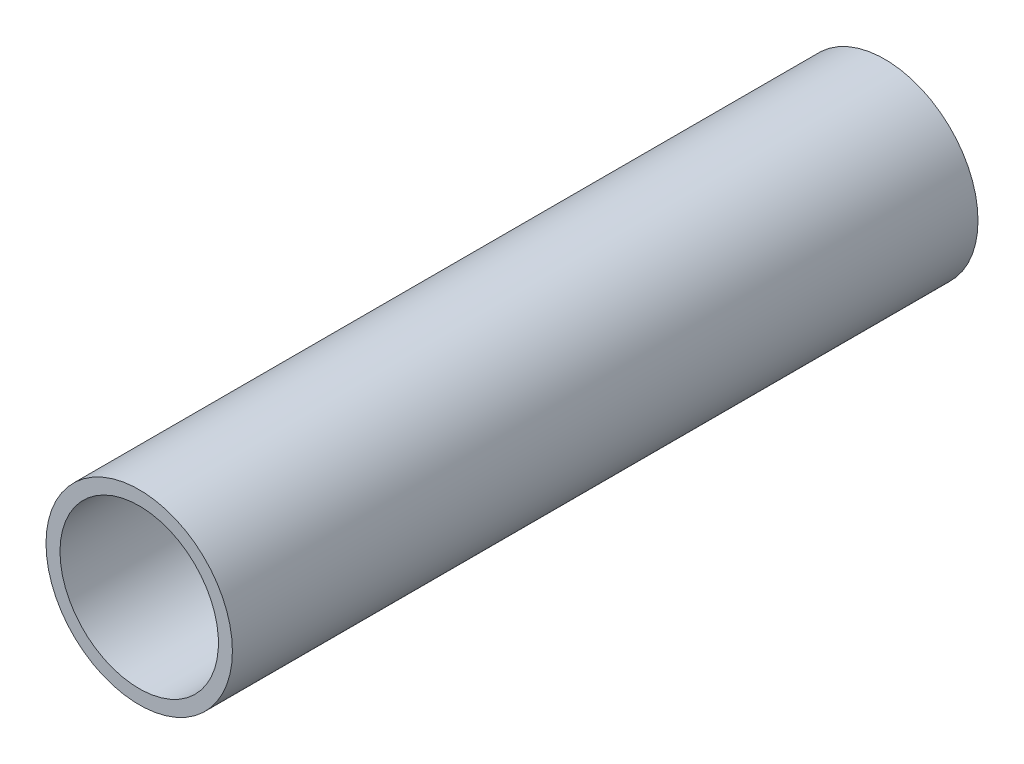
ISO-10303-21;
HEADER;
FILE_DESCRIPTION(('STEP AP214'),'2;1');
FILE_NAME('part.step','',(''),(''),'','','');
FILE_SCHEMA(('AUTOMOTIVE_DESIGN { 1 0 10303 214 1 1 1 1 }'));
ENDSEC;
DATA;
#1=APPLICATION_CONTEXT('core data for automotive mechanical design processes');
#2=APPLICATION_PROTOCOL_DEFINITION('international standard','automotive_design',2000,#1);
#3=PRODUCT_CONTEXT('',#1,'mechanical');
#4=PRODUCT('Part','Part','',(#3));
#5=PRODUCT_RELATED_PRODUCT_CATEGORY('part','',(#4));
#6=PRODUCT_DEFINITION_FORMATION('','',#4);
#7=PRODUCT_DEFINITION_CONTEXT('part definition',#1,'design');
#8=PRODUCT_DEFINITION('design','',#6,#7);
#9=PRODUCT_DEFINITION_SHAPE('','',#8);
#10=(LENGTH_UNIT() NAMED_UNIT(*) SI_UNIT(.MILLI.,.METRE.));
#11=(NAMED_UNIT(*) PLANE_ANGLE_UNIT() SI_UNIT($,.RADIAN.));
#12=(NAMED_UNIT(*) SI_UNIT($,.STERADIAN.) SOLID_ANGLE_UNIT());
#13=UNCERTAINTY_MEASURE_WITH_UNIT(LENGTH_MEASURE(1.E-05),#10,'distance_accuracy_value','');
#14=(GEOMETRIC_REPRESENTATION_CONTEXT(3) GLOBAL_UNCERTAINTY_ASSIGNED_CONTEXT((#13)) GLOBAL_UNIT_ASSIGNED_CONTEXT((#10,
#11,#12)) REPRESENTATION_CONTEXT('',''));
#15=CARTESIAN_POINT('',(0.,0.,0.));
#16=DIRECTION('',(0.,0.,1.));
#17=DIRECTION('',(1.,0.,0.));
#18=AXIS2_PLACEMENT_3D('',#15,#16,#17);
#19=CARTESIAN_POINT('',(0.,0.,64.));
#20=DIRECTION('',(0.,0.,-1.));
#21=DIRECTION('',(-1.,0.,0.));
#22=AXIS2_PLACEMENT_3D('',#19,#20,#21);
#23=CYLINDRICAL_SURFACE('',#22,13.6);
#24=CARTESIAN_POINT('',(0.,0.,128.));
#25=DIRECTION('',(0.,0.,-1.));
#26=DIRECTION('',(-1.,0.,0.));
#27=AXIS2_PLACEMENT_3D('',#24,#25,#26);
#28=CIRCLE('',#27,13.6);
#29=CARTESIAN_POINT('',(-13.6,0.,128.));
#30=VERTEX_POINT('',#29);
#31=EDGE_CURVE('E25',#30,#30,#28,.T.);
#32=ORIENTED_EDGE('',*,*,#31,.F.);
#33=EDGE_LOOP('',(#32));
#34=FACE_BOUND('',#33,.T.);
#35=CARTESIAN_POINT('',(0.,0.,0.));
#36=DIRECTION('',(0.,0.,-1.));
#37=DIRECTION('',(-1.,0.,0.));
#38=AXIS2_PLACEMENT_3D('',#35,#36,#37);
#39=CIRCLE('',#38,13.6);
#40=CARTESIAN_POINT('',(-13.6,0.,0.));
#41=VERTEX_POINT('',#40);
#42=EDGE_CURVE('E16',#41,#41,#39,.F.);
#43=ORIENTED_EDGE('',*,*,#42,.F.);
#44=EDGE_LOOP('',(#43));
#45=FACE_BOUND('',#44,.T.);
#46=ADVANCED_FACE('F13',(#34,#45),#23,.F.);
#47=CARTESIAN_POINT('',(0.,0.,0.));
#48=DIRECTION('',(0.,0.,-1.));
#49=DIRECTION('',(-1.,0.,0.));
#50=AXIS2_PLACEMENT_3D('',#47,#48,#49);
#51=PLANE('',#50);
#52=CARTESIAN_POINT('',(0.,0.,0.));
#53=DIRECTION('',(0.,0.,-1.));
#54=DIRECTION('',(-1.,0.,0.));
#55=AXIS2_PLACEMENT_3D('',#52,#53,#54);
#56=CIRCLE('',#55,16.);
#57=CARTESIAN_POINT('',(-16.,0.,0.));
#58=VERTEX_POINT('',#57);
#59=EDGE_CURVE('E20',#58,#58,#56,.F.);
#60=ORIENTED_EDGE('',*,*,#59,.F.);
#61=EDGE_LOOP('',(#60));
#62=FACE_BOUND('',#61,.T.);
#63=ORIENTED_EDGE('',*,*,#42,.T.);
#64=EDGE_LOOP('',(#63));
#65=FACE_BOUND('',#64,.T.);
#66=ADVANCED_FACE('F33',(#62,#65),#51,.T.);
#67=CARTESIAN_POINT('',(0.,0.,128.));
#68=DIRECTION('',(0.,0.,1.));
#69=DIRECTION('',(1.,0.,0.));
#70=AXIS2_PLACEMENT_3D('',#67,#68,#69);
#71=PLANE('',#70);
#72=CARTESIAN_POINT('',(0.,0.,128.));
#73=DIRECTION('',(0.,0.,-1.));
#74=DIRECTION('',(-1.,0.,0.));
#75=AXIS2_PLACEMENT_3D('',#72,#73,#74);
#76=CIRCLE('',#75,16.);
#77=CARTESIAN_POINT('',(-16.,0.,128.));
#78=VERTEX_POINT('',#77);
#79=EDGE_CURVE('E8',#78,#78,#76,.T.);
#80=ORIENTED_EDGE('',*,*,#79,.F.);
#81=EDGE_LOOP('',(#80));
#82=FACE_BOUND('',#81,.T.);
#83=ORIENTED_EDGE('',*,*,#31,.T.);
#84=EDGE_LOOP('',(#83));
#85=FACE_BOUND('',#84,.T.);
#86=ADVANCED_FACE('F41',(#82,#85),#71,.T.);
#87=CARTESIAN_POINT('',(0.,0.,64.));
#88=DIRECTION('',(0.,0.,-1.));
#89=DIRECTION('',(-1.,0.,0.));
#90=AXIS2_PLACEMENT_3D('',#87,#88,#89);
#91=CYLINDRICAL_SURFACE('',#90,16.);
#92=ORIENTED_EDGE('',*,*,#59,.T.);
#93=EDGE_LOOP('',(#92));
#94=FACE_BOUND('',#93,.T.);
#95=ORIENTED_EDGE('',*,*,#79,.T.);
#96=EDGE_LOOP('',(#95));
#97=FACE_BOUND('',#96,.T.);
#98=ADVANCED_FACE('F43',(#94,#97),#91,.T.);
#99=CLOSED_SHELL('',(#46,#66,#86,#98));
#100=MANIFOLD_SOLID_BREP('B1',#99);
#101=ADVANCED_BREP_SHAPE_REPRESENTATION('',(#18,#100),#14);
#102=SHAPE_DEFINITION_REPRESENTATION(#9,#101);
ENDSEC;
END-ISO-10303-21;
